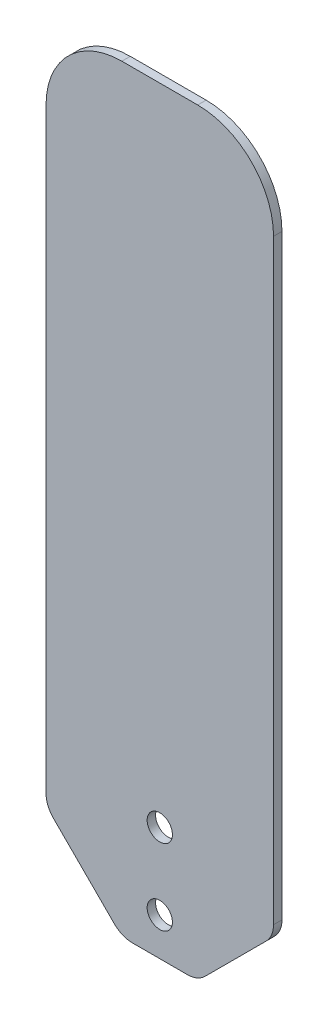
ISO-10303-21;
HEADER;
FILE_DESCRIPTION(('STEP AP214'),'2;1');
FILE_NAME('part.step','',(''),(''),'','','');
FILE_SCHEMA(('AUTOMOTIVE_DESIGN { 1 0 10303 214 1 1 1 1 }'));
ENDSEC;
DATA;
#1=APPLICATION_CONTEXT('core data for automotive mechanical design processes');
#2=APPLICATION_PROTOCOL_DEFINITION('international standard','automotive_design',2000,#1);
#3=PRODUCT_CONTEXT('',#1,'mechanical');
#4=PRODUCT('Part','Part','',(#3));
#5=PRODUCT_RELATED_PRODUCT_CATEGORY('part','',(#4));
#6=PRODUCT_DEFINITION_FORMATION('','',#4);
#7=PRODUCT_DEFINITION_CONTEXT('part definition',#1,'design');
#8=PRODUCT_DEFINITION('design','',#6,#7);
#9=PRODUCT_DEFINITION_SHAPE('','',#8);
#10=(LENGTH_UNIT() NAMED_UNIT(*) SI_UNIT(.MILLI.,.METRE.));
#11=(NAMED_UNIT(*) PLANE_ANGLE_UNIT() SI_UNIT($,.RADIAN.));
#12=(NAMED_UNIT(*) SI_UNIT($,.STERADIAN.) SOLID_ANGLE_UNIT());
#13=UNCERTAINTY_MEASURE_WITH_UNIT(LENGTH_MEASURE(1.E-05),#10,'distance_accuracy_value','');
#14=(GEOMETRIC_REPRESENTATION_CONTEXT(3) GLOBAL_UNCERTAINTY_ASSIGNED_CONTEXT((#13)) GLOBAL_UNIT_ASSIGNED_CONTEXT((#10,
#11,#12)) REPRESENTATION_CONTEXT('',''));
#15=CARTESIAN_POINT('',(0.,0.,0.));
#16=DIRECTION('',(0.,0.,1.));
#17=DIRECTION('',(1.,0.,0.));
#18=AXIS2_PLACEMENT_3D('',#15,#16,#17);
#19=CARTESIAN_POINT('',(103.6498900849,249.7618815997,1.));
#20=DIRECTION('',(0.,0.,1.));
#21=DIRECTION('',(1.,0.,0.));
#22=AXIS2_PLACEMENT_3D('',#19,#20,#21);
#23=PLANE('',#22);
#24=CARTESIAN_POINT('',(99.1498900849,173.2618815997,1.));
#25=DIRECTION('',(0.,0.,1.));
#26=DIRECTION('',(1.,0.,0.));
#27=AXIS2_PLACEMENT_3D('',#24,#25,#26);
#28=CIRCLE('',#27,1.5);
#29=CARTESIAN_POINT('',(100.6498900849,173.2618815997,1.));
#30=VERTEX_POINT('',#29);
#31=EDGE_CURVE('E158',#30,#30,#28,.T.);
#32=ORIENTED_EDGE('',*,*,#31,.F.);
#33=EDGE_LOOP('',(#32));
#34=FACE_BOUND('',#33,.T.);
#35=CARTESIAN_POINT('',(103.6498900849,249.7618815997,1.));
#36=DIRECTION('',(0.,0.,1.));
#37=DIRECTION('',(1.,0.,0.));
#38=AXIS2_PLACEMENT_3D('',#35,#36,#37);
#39=CIRCLE('',#38,9.00000000000001);
#40=CARTESIAN_POINT('',(112.6498900849,249.7618815997,1.));
#41=VERTEX_POINT('',#40);
#42=CARTESIAN_POINT('',(103.6498900849,258.7618815997,1.));
#43=VERTEX_POINT('',#42);
#44=EDGE_CURVE('E177',#41,#43,#39,.T.);
#45=ORIENTED_EDGE('',*,*,#44,.T.);
#46=DIRECTION('',(-1.,0.,0.));
#47=VECTOR('',#46,1.);
#48=CARTESIAN_POINT('',(103.6498900849,258.7618815997,1.));
#49=LINE('',#48,#47);
#50=CARTESIAN_POINT('',(94.6498900849,258.7618815997,1.));
#51=VERTEX_POINT('',#50);
#52=EDGE_CURVE('E105',#43,#51,#49,.T.);
#53=ORIENTED_EDGE('',*,*,#52,.T.);
#54=CARTESIAN_POINT('',(94.6498900849,249.7618815997,1.));
#55=DIRECTION('',(0.,0.,1.));
#56=DIRECTION('',(1.,0.,0.));
#57=AXIS2_PLACEMENT_3D('',#54,#55,#56);
#58=CIRCLE('',#57,9.00000000000001);
#59=CARTESIAN_POINT('',(85.6498900849,249.7618815997,1.));
#60=VERTEX_POINT('',#59);
#61=EDGE_CURVE('E204',#51,#60,#58,.T.);
#62=ORIENTED_EDGE('',*,*,#61,.T.);
#63=DIRECTION('',(0.,-1.,0.));
#64=VECTOR('',#63,1.);
#65=CARTESIAN_POINT('',(85.6498900849,249.7618815997,1.));
#66=LINE('',#65,#64);
#67=CARTESIAN_POINT('',(85.6498900849,179.0045222868,1.));
#68=VERTEX_POINT('',#67);
#69=EDGE_CURVE('E223',#60,#68,#66,.T.);
#70=ORIENTED_EDGE('',*,*,#69,.T.);
#71=CARTESIAN_POINT('',(88.6498900849,179.004522286819,1.));
#72=DIRECTION('',(0.,0.,1.));
#73=DIRECTION('',(1.,0.,0.));
#74=AXIS2_PLACEMENT_3D('',#71,#72,#73);
#75=CIRCLE('',#74,3.00000000000001);
#76=CARTESIAN_POINT('',(86.5285697414,176.8832019432,1.));
#77=VERTEX_POINT('',#76);
#78=EDGE_CURVE('E220',#68,#77,#75,.T.);
#79=ORIENTED_EDGE('',*,*,#78,.T.);
#80=DIRECTION('',(0.707106781186547,-0.707106781186548,0.));
#81=VECTOR('',#80,1.);
#82=CARTESIAN_POINT('',(93.7712104285,169.6405612561,1.));
#83=LINE('',#82,#81);
#84=CARTESIAN_POINT('',(93.7712104285,169.6405612561,1.));
#85=VERTEX_POINT('',#84);
#86=EDGE_CURVE('E222',#77,#85,#83,.T.);
#87=ORIENTED_EDGE('',*,*,#86,.T.);
#88=CARTESIAN_POINT('',(95.8925307720193,171.7618815997,1.));
#89=DIRECTION('',(0.,0.,1.));
#90=DIRECTION('',(1.,0.,0.));
#91=AXIS2_PLACEMENT_3D('',#88,#89,#90);
#92=CIRCLE('',#91,3.);
#93=CARTESIAN_POINT('',(95.8925307721,168.7618815997,1.));
#94=VERTEX_POINT('',#93);
#95=EDGE_CURVE('E225',#85,#94,#92,.T.);
#96=ORIENTED_EDGE('',*,*,#95,.T.);
#97=DIRECTION('',(1.,0.,0.));
#98=VECTOR('',#97,1.);
#99=CARTESIAN_POINT('',(95.8925307721,168.7618815997,1.));
#100=LINE('',#99,#98);
#101=CARTESIAN_POINT('',(102.4072493978,168.7618815997,1.));
#102=VERTEX_POINT('',#101);
#103=EDGE_CURVE('E231',#94,#102,#100,.T.);
#104=ORIENTED_EDGE('',*,*,#103,.T.);
#105=CARTESIAN_POINT('',(102.407249397881,171.7618815997,1.));
#106=DIRECTION('',(0.,0.,1.));
#107=DIRECTION('',(1.,0.,0.));
#108=AXIS2_PLACEMENT_3D('',#105,#106,#107);
#109=CIRCLE('',#108,3.00000000000001);
#110=CARTESIAN_POINT('',(104.5285697414,169.6405612561,1.));
#111=VERTEX_POINT('',#110);
#112=EDGE_CURVE('E136',#102,#111,#109,.T.);
#113=ORIENTED_EDGE('',*,*,#112,.T.);
#114=DIRECTION('',(0.707106781186546,0.707106781186549,0.));
#115=VECTOR('',#114,1.);
#116=CARTESIAN_POINT('',(104.5285697414,169.6405612561,1.));
#117=LINE('',#116,#115);
#118=CARTESIAN_POINT('',(111.7712104285,176.8832019432,1.));
#119=VERTEX_POINT('',#118);
#120=EDGE_CURVE('E130',#111,#119,#117,.T.);
#121=ORIENTED_EDGE('',*,*,#120,.T.);
#122=CARTESIAN_POINT('',(109.6498900849,179.004522286719,1.));
#123=DIRECTION('',(0.,0.,1.));
#124=DIRECTION('',(1.,0.,0.));
#125=AXIS2_PLACEMENT_3D('',#122,#123,#124);
#126=CIRCLE('',#125,3.);
#127=CARTESIAN_POINT('',(112.6498900849,179.0045222868,1.));
#128=VERTEX_POINT('',#127);
#129=EDGE_CURVE('E134',#119,#128,#126,.T.);
#130=ORIENTED_EDGE('',*,*,#129,.T.);
#131=DIRECTION('',(0.,1.,0.));
#132=VECTOR('',#131,1.);
#133=CARTESIAN_POINT('',(112.6498900849,179.0045222868,1.));
#134=LINE('',#133,#132);
#135=EDGE_CURVE('E50',#128,#41,#134,.T.);
#136=ORIENTED_EDGE('',*,*,#135,.T.);
#137=EDGE_LOOP('',(#45,#53,#62,#70,#79,#87,#96,#104,#113,#121,#130,#136));
#138=FACE_BOUND('',#137,.T.);
#139=CARTESIAN_POINT('',(99.1498900849,182.2618815997,1.));
#140=DIRECTION('',(0.,0.,1.));
#141=DIRECTION('',(1.,0.,0.));
#142=AXIS2_PLACEMENT_3D('',#139,#140,#141);
#143=CIRCLE('',#142,1.5);
#144=CARTESIAN_POINT('',(100.6498900849,182.2618815997,1.));
#145=VERTEX_POINT('',#144);
#146=EDGE_CURVE('E274',#145,#145,#143,.T.);
#147=ORIENTED_EDGE('',*,*,#146,.F.);
#148=EDGE_LOOP('',(#147));
#149=FACE_BOUND('',#148,.T.);
#150=ADVANCED_FACE('F33',(#34,#138,#149),#23,.T.);
#151=CARTESIAN_POINT('',(103.6498900849,249.7618815997,0.));
#152=DIRECTION('',(0.,0.,1.));
#153=DIRECTION('',(1.,0.,0.));
#154=AXIS2_PLACEMENT_3D('',#151,#152,#153);
#155=PLANE('',#154);
#156=CARTESIAN_POINT('',(99.1498900849,173.2618815997,0.));
#157=DIRECTION('',(0.,0.,1.));
#158=DIRECTION('',(1.,0.,0.));
#159=AXIS2_PLACEMENT_3D('',#156,#157,#158);
#160=CIRCLE('',#159,1.5);
#161=CARTESIAN_POINT('',(100.6498900849,173.2618815997,0.));
#162=VERTEX_POINT('',#161);
#163=EDGE_CURVE('E279',#162,#162,#160,.T.);
#164=ORIENTED_EDGE('',*,*,#163,.T.);
#165=EDGE_LOOP('',(#164));
#166=FACE_BOUND('',#165,.T.);
#167=CARTESIAN_POINT('',(103.6498900849,249.7618815997,0.));
#168=DIRECTION('',(0.,0.,1.));
#169=DIRECTION('',(1.,0.,0.));
#170=AXIS2_PLACEMENT_3D('',#167,#168,#169);
#171=CIRCLE('',#170,9.00000000000001);
#172=CARTESIAN_POINT('',(112.6498900849,249.7618815997,0.));
#173=VERTEX_POINT('',#172);
#174=CARTESIAN_POINT('',(103.6498900849,258.7618815997,0.));
#175=VERTEX_POINT('',#174);
#176=EDGE_CURVE('E154',#173,#175,#171,.T.);
#177=ORIENTED_EDGE('',*,*,#176,.F.);
#178=DIRECTION('',(0.,1.,0.));
#179=VECTOR('',#178,1.);
#180=CARTESIAN_POINT('',(112.6498900849,179.0045222868,0.));
#181=LINE('',#180,#179);
#182=CARTESIAN_POINT('',(112.6498900849,179.0045222868,0.));
#183=VERTEX_POINT('',#182);
#184=EDGE_CURVE('E97',#183,#173,#181,.T.);
#185=ORIENTED_EDGE('',*,*,#184,.F.);
#186=CARTESIAN_POINT('',(109.6498900849,179.004522286719,0.));
#187=DIRECTION('',(0.,0.,1.));
#188=DIRECTION('',(1.,0.,0.));
#189=AXIS2_PLACEMENT_3D('',#186,#187,#188);
#190=CIRCLE('',#189,3.);
#191=CARTESIAN_POINT('',(111.7712104285,176.8832019432,0.));
#192=VERTEX_POINT('',#191);
#193=EDGE_CURVE('E91',#192,#183,#190,.T.);
#194=ORIENTED_EDGE('',*,*,#193,.F.);
#195=DIRECTION('',(0.707106781186546,0.707106781186549,0.));
#196=VECTOR('',#195,1.);
#197=CARTESIAN_POINT('',(104.5285697414,169.6405612561,0.));
#198=LINE('',#197,#196);
#199=CARTESIAN_POINT('',(104.5285697414,169.6405612561,0.));
#200=VERTEX_POINT('',#199);
#201=EDGE_CURVE('E144',#200,#192,#198,.T.);
#202=ORIENTED_EDGE('',*,*,#201,.F.);
#203=CARTESIAN_POINT('',(102.407249397881,171.7618815997,0.));
#204=DIRECTION('',(0.,0.,1.));
#205=DIRECTION('',(1.,0.,0.));
#206=AXIS2_PLACEMENT_3D('',#203,#204,#205);
#207=CIRCLE('',#206,3.00000000000001);
#208=CARTESIAN_POINT('',(102.4072493978,168.7618815997,0.));
#209=VERTEX_POINT('',#208);
#210=EDGE_CURVE('E172',#209,#200,#207,.T.);
#211=ORIENTED_EDGE('',*,*,#210,.F.);
#212=DIRECTION('',(1.,0.,0.));
#213=VECTOR('',#212,1.);
#214=CARTESIAN_POINT('',(95.8925307721,168.7618815997,0.));
#215=LINE('',#214,#213);
#216=CARTESIAN_POINT('',(95.8925307721,168.7618815997,0.));
#217=VERTEX_POINT('',#216);
#218=EDGE_CURVE('E170',#217,#209,#215,.T.);
#219=ORIENTED_EDGE('',*,*,#218,.F.);
#220=CARTESIAN_POINT('',(95.8925307720193,171.7618815997,0.));
#221=DIRECTION('',(0.,0.,1.));
#222=DIRECTION('',(1.,0.,0.));
#223=AXIS2_PLACEMENT_3D('',#220,#221,#222);
#224=CIRCLE('',#223,3.);
#225=CARTESIAN_POINT('',(93.7712104285,169.6405612561,0.));
#226=VERTEX_POINT('',#225);
#227=EDGE_CURVE('E168',#226,#217,#224,.T.);
#228=ORIENTED_EDGE('',*,*,#227,.F.);
#229=DIRECTION('',(0.707106781186547,-0.707106781186548,0.));
#230=VECTOR('',#229,1.);
#231=CARTESIAN_POINT('',(93.7712104285,169.6405612561,0.));
#232=LINE('',#231,#230);
#233=CARTESIAN_POINT('',(86.5285697414,176.8832019432,0.));
#234=VERTEX_POINT('',#233);
#235=EDGE_CURVE('E166',#234,#226,#232,.T.);
#236=ORIENTED_EDGE('',*,*,#235,.F.);
#237=CARTESIAN_POINT('',(88.6498900849,179.004522286819,0.));
#238=DIRECTION('',(0.,0.,1.));
#239=DIRECTION('',(1.,0.,0.));
#240=AXIS2_PLACEMENT_3D('',#237,#238,#239);
#241=CIRCLE('',#240,3.00000000000001);
#242=CARTESIAN_POINT('',(85.6498900849,179.0045222868,0.));
#243=VERTEX_POINT('',#242);
#244=EDGE_CURVE('E164',#243,#234,#241,.T.);
#245=ORIENTED_EDGE('',*,*,#244,.F.);
#246=DIRECTION('',(0.,-1.,0.));
#247=VECTOR('',#246,1.);
#248=CARTESIAN_POINT('',(85.6498900849,249.7618815997,0.));
#249=LINE('',#248,#247);
#250=CARTESIAN_POINT('',(85.6498900849,249.7618815997,0.));
#251=VERTEX_POINT('',#250);
#252=EDGE_CURVE('E162',#251,#243,#249,.T.);
#253=ORIENTED_EDGE('',*,*,#252,.F.);
#254=CARTESIAN_POINT('',(94.6498900849,249.7618815997,0.));
#255=DIRECTION('',(0.,0.,1.));
#256=DIRECTION('',(1.,0.,0.));
#257=AXIS2_PLACEMENT_3D('',#254,#255,#256);
#258=CIRCLE('',#257,9.00000000000001);
#259=CARTESIAN_POINT('',(94.6498900849,258.7618815997,0.));
#260=VERTEX_POINT('',#259);
#261=EDGE_CURVE('E160',#260,#251,#258,.T.);
#262=ORIENTED_EDGE('',*,*,#261,.F.);
#263=DIRECTION('',(-1.,0.,0.));
#264=VECTOR('',#263,1.);
#265=CARTESIAN_POINT('',(103.6498900849,258.7618815997,0.));
#266=LINE('',#265,#264);
#267=EDGE_CURVE('E157',#175,#260,#266,.T.);
#268=ORIENTED_EDGE('',*,*,#267,.F.);
#269=EDGE_LOOP('',(#177,#185,#194,#202,#211,#219,#228,#236,#245,#253,#262,#268));
#270=FACE_BOUND('',#269,.T.);
#271=CARTESIAN_POINT('',(99.1498900849,182.2618815997,0.));
#272=DIRECTION('',(0.,0.,1.));
#273=DIRECTION('',(1.,0.,0.));
#274=AXIS2_PLACEMENT_3D('',#271,#272,#273);
#275=CIRCLE('',#274,1.5);
#276=CARTESIAN_POINT('',(100.6498900849,182.2618815997,0.));
#277=VERTEX_POINT('',#276);
#278=EDGE_CURVE('E277',#277,#277,#275,.T.);
#279=ORIENTED_EDGE('',*,*,#278,.T.);
#280=EDGE_LOOP('',(#279));
#281=FACE_BOUND('',#280,.T.);
#282=ADVANCED_FACE('F208',(#166,#270,#281),#155,.F.);
#283=CARTESIAN_POINT('',(103.6498900849,249.7618815997,1.));
#284=DIRECTION('',(0.,0.,-1.));
#285=DIRECTION('',(-1.,0.,0.));
#286=AXIS2_PLACEMENT_3D('',#283,#284,#285);
#287=CYLINDRICAL_SURFACE('',#286,9.00000000000001);
#288=ORIENTED_EDGE('',*,*,#176,.T.);
#289=DIRECTION('',(0.,0.,-1.));
#290=VECTOR('',#289,1.);
#291=CARTESIAN_POINT('',(103.6498900849,258.7618815997,1.));
#292=LINE('',#291,#290);
#293=EDGE_CURVE('E11',#43,#175,#292,.T.);
#294=ORIENTED_EDGE('',*,*,#293,.F.);
#295=ORIENTED_EDGE('',*,*,#44,.F.);
#296=DIRECTION('',(0.,0.,-1.));
#297=VECTOR('',#296,1.);
#298=CARTESIAN_POINT('',(112.6498900849,249.7618815997,1.));
#299=LINE('',#298,#297);
#300=EDGE_CURVE('E150',#41,#173,#299,.T.);
#301=ORIENTED_EDGE('',*,*,#300,.T.);
#302=EDGE_LOOP('',(#288,#294,#295,#301));
#303=FACE_BOUND('',#302,.T.);
#304=ADVANCED_FACE('F35',(#303),#287,.T.);
#305=CARTESIAN_POINT('',(103.6498900849,258.7618815997,1.));
#306=DIRECTION('',(0.,-1.,0.));
#307=DIRECTION('',(0.,0.,-1.));
#308=AXIS2_PLACEMENT_3D('',#305,#306,#307);
#309=PLANE('',#308);
#310=ORIENTED_EDGE('',*,*,#267,.T.);
#311=DIRECTION('',(0.,0.,-1.));
#312=VECTOR('',#311,1.);
#313=CARTESIAN_POINT('',(94.6498900849,258.7618815997,1.));
#314=LINE('',#313,#312);
#315=EDGE_CURVE('E42',#51,#260,#314,.T.);
#316=ORIENTED_EDGE('',*,*,#315,.F.);
#317=ORIENTED_EDGE('',*,*,#52,.F.);
#318=ORIENTED_EDGE('',*,*,#293,.T.);
#319=EDGE_LOOP('',(#310,#316,#317,#318));
#320=FACE_BOUND('',#319,.T.);
#321=ADVANCED_FACE('F372',(#320),#309,.F.);
#322=CARTESIAN_POINT('',(94.6498900849,249.7618815997,1.));
#323=DIRECTION('',(0.,0.,-1.));
#324=DIRECTION('',(-1.,0.,0.));
#325=AXIS2_PLACEMENT_3D('',#322,#323,#324);
#326=CYLINDRICAL_SURFACE('',#325,9.00000000000001);
#327=ORIENTED_EDGE('',*,*,#261,.T.);
#328=DIRECTION('',(0.,0.,-1.));
#329=VECTOR('',#328,1.);
#330=CARTESIAN_POINT('',(85.6498900849,249.7618815997,1.));
#331=LINE('',#330,#329);
#332=EDGE_CURVE('E196',#60,#251,#331,.T.);
#333=ORIENTED_EDGE('',*,*,#332,.F.);
#334=ORIENTED_EDGE('',*,*,#61,.F.);
#335=ORIENTED_EDGE('',*,*,#315,.T.);
#336=EDGE_LOOP('',(#327,#333,#334,#335));
#337=FACE_BOUND('',#336,.T.);
#338=ADVANCED_FACE('F202',(#337),#326,.T.);
#339=CARTESIAN_POINT('',(85.6498900849,249.7618815997,1.));
#340=DIRECTION('',(1.,0.,0.));
#341=DIRECTION('',(0.,0.,-1.));
#342=AXIS2_PLACEMENT_3D('',#339,#340,#341);
#343=PLANE('',#342);
#344=ORIENTED_EDGE('',*,*,#252,.T.);
#345=DIRECTION('',(0.,0.,-1.));
#346=VECTOR('',#345,1.);
#347=CARTESIAN_POINT('',(85.6498900849,179.0045222868,1.));
#348=LINE('',#347,#346);
#349=EDGE_CURVE('E193',#68,#243,#348,.T.);
#350=ORIENTED_EDGE('',*,*,#349,.F.);
#351=ORIENTED_EDGE('',*,*,#69,.F.);
#352=ORIENTED_EDGE('',*,*,#332,.T.);
#353=EDGE_LOOP('',(#344,#350,#351,#352));
#354=FACE_BOUND('',#353,.T.);
#355=ADVANCED_FACE('F214',(#354),#343,.F.);
#356=CARTESIAN_POINT('',(88.6498900849,179.004522286819,1.));
#357=DIRECTION('',(0.,0.,-1.));
#358=DIRECTION('',(-1.,0.,0.));
#359=AXIS2_PLACEMENT_3D('',#356,#357,#358);
#360=CYLINDRICAL_SURFACE('',#359,3.00000000000001);
#361=ORIENTED_EDGE('',*,*,#244,.T.);
#362=DIRECTION('',(0.,0.,-1.));
#363=VECTOR('',#362,1.);
#364=CARTESIAN_POINT('',(86.5285697414,176.8832019432,1.));
#365=LINE('',#364,#363);
#366=EDGE_CURVE('E190',#77,#234,#365,.T.);
#367=ORIENTED_EDGE('',*,*,#366,.F.);
#368=ORIENTED_EDGE('',*,*,#78,.F.);
#369=ORIENTED_EDGE('',*,*,#349,.T.);
#370=EDGE_LOOP('',(#361,#367,#368,#369));
#371=FACE_BOUND('',#370,.T.);
#372=ADVANCED_FACE('F218',(#371),#360,.T.);
#373=CARTESIAN_POINT('',(93.7712104285,169.6405612561,1.));
#374=DIRECTION('',(0.707106781186548,0.707106781186547,0.));
#375=DIRECTION('',(-0.707106781186547,0.707106781186548,0.));
#376=AXIS2_PLACEMENT_3D('',#373,#374,#375);
#377=PLANE('',#376);
#378=ORIENTED_EDGE('',*,*,#235,.T.);
#379=DIRECTION('',(0.,0.,-1.));
#380=VECTOR('',#379,1.);
#381=CARTESIAN_POINT('',(93.7712104285,169.6405612561,1.));
#382=LINE('',#381,#380);
#383=EDGE_CURVE('E187',#85,#226,#382,.T.);
#384=ORIENTED_EDGE('',*,*,#383,.F.);
#385=ORIENTED_EDGE('',*,*,#86,.F.);
#386=ORIENTED_EDGE('',*,*,#366,.T.);
#387=EDGE_LOOP('',(#378,#384,#385,#386));
#388=FACE_BOUND('',#387,.T.);
#389=ADVANCED_FACE('F337',(#388),#377,.F.);
#390=CARTESIAN_POINT('',(95.8925307720193,171.7618815997,1.));
#391=DIRECTION('',(0.,0.,-1.));
#392=DIRECTION('',(-1.,0.,0.));
#393=AXIS2_PLACEMENT_3D('',#390,#391,#392);
#394=CYLINDRICAL_SURFACE('',#393,3.);
#395=ORIENTED_EDGE('',*,*,#227,.T.);
#396=DIRECTION('',(0.,0.,-1.));
#397=VECTOR('',#396,1.);
#398=CARTESIAN_POINT('',(95.8925307721,168.7618815997,1.));
#399=LINE('',#398,#397);
#400=EDGE_CURVE('E184',#94,#217,#399,.T.);
#401=ORIENTED_EDGE('',*,*,#400,.F.);
#402=ORIENTED_EDGE('',*,*,#95,.F.);
#403=ORIENTED_EDGE('',*,*,#383,.T.);
#404=EDGE_LOOP('',(#395,#401,#402,#403));
#405=FACE_BOUND('',#404,.T.);
#406=ADVANCED_FACE('F328',(#405),#394,.T.);
#407=CARTESIAN_POINT('',(95.8925307721,168.7618815997,1.));
#408=DIRECTION('',(0.,1.,0.));
#409=DIRECTION('',(0.,0.,1.));
#410=AXIS2_PLACEMENT_3D('',#407,#408,#409);
#411=PLANE('',#410);
#412=ORIENTED_EDGE('',*,*,#218,.T.);
#413=DIRECTION('',(0.,0.,-1.));
#414=VECTOR('',#413,1.);
#415=CARTESIAN_POINT('',(102.4072493978,168.7618815997,1.));
#416=LINE('',#415,#414);
#417=EDGE_CURVE('E181',#102,#209,#416,.T.);
#418=ORIENTED_EDGE('',*,*,#417,.F.);
#419=ORIENTED_EDGE('',*,*,#103,.F.);
#420=ORIENTED_EDGE('',*,*,#400,.T.);
#421=EDGE_LOOP('',(#412,#418,#419,#420));
#422=FACE_BOUND('',#421,.T.);
#423=ADVANCED_FACE('F237',(#422),#411,.F.);
#424=CARTESIAN_POINT('',(102.407249397881,171.7618815997,1.));
#425=DIRECTION('',(0.,0.,-1.));
#426=DIRECTION('',(-1.,0.,0.));
#427=AXIS2_PLACEMENT_3D('',#424,#425,#426);
#428=CYLINDRICAL_SURFACE('',#427,3.00000000000001);
#429=ORIENTED_EDGE('',*,*,#210,.T.);
#430=DIRECTION('',(0.,0.,-1.));
#431=VECTOR('',#430,1.);
#432=CARTESIAN_POINT('',(104.5285697414,169.6405612561,1.));
#433=LINE('',#432,#431);
#434=EDGE_CURVE('E145',#111,#200,#433,.T.);
#435=ORIENTED_EDGE('',*,*,#434,.F.);
#436=ORIENTED_EDGE('',*,*,#112,.F.);
#437=ORIENTED_EDGE('',*,*,#417,.T.);
#438=EDGE_LOOP('',(#429,#435,#436,#437));
#439=FACE_BOUND('',#438,.T.);
#440=ADVANCED_FACE('F241',(#439),#428,.T.);
#441=CARTESIAN_POINT('',(104.5285697414,169.6405612561,1.));
#442=DIRECTION('',(-0.707106781186549,0.707106781186546,0.));
#443=DIRECTION('',(-0.707106781186546,-0.707106781186549,0.));
#444=AXIS2_PLACEMENT_3D('',#441,#442,#443);
#445=PLANE('',#444);
#446=ORIENTED_EDGE('',*,*,#201,.T.);
#447=DIRECTION('',(0.,0.,-1.));
#448=VECTOR('',#447,1.);
#449=CARTESIAN_POINT('',(111.7712104285,176.8832019432,1.));
#450=LINE('',#449,#448);
#451=EDGE_CURVE('E141',#119,#192,#450,.T.);
#452=ORIENTED_EDGE('',*,*,#451,.F.);
#453=ORIENTED_EDGE('',*,*,#120,.F.);
#454=ORIENTED_EDGE('',*,*,#434,.T.);
#455=EDGE_LOOP('',(#446,#452,#453,#454));
#456=FACE_BOUND('',#455,.T.);
#457=ADVANCED_FACE('F142',(#456),#445,.F.);
#458=CARTESIAN_POINT('',(109.6498900849,179.004522286719,1.));
#459=DIRECTION('',(0.,0.,-1.));
#460=DIRECTION('',(-1.,0.,0.));
#461=AXIS2_PLACEMENT_3D('',#458,#459,#460);
#462=CYLINDRICAL_SURFACE('',#461,3.);
#463=ORIENTED_EDGE('',*,*,#193,.T.);
#464=DIRECTION('',(0.,0.,-1.));
#465=VECTOR('',#464,1.);
#466=CARTESIAN_POINT('',(112.6498900849,179.0045222868,1.));
#467=LINE('',#466,#465);
#468=EDGE_CURVE('E146',#128,#183,#467,.T.);
#469=ORIENTED_EDGE('',*,*,#468,.F.);
#470=ORIENTED_EDGE('',*,*,#129,.F.);
#471=ORIENTED_EDGE('',*,*,#451,.T.);
#472=EDGE_LOOP('',(#463,#469,#470,#471));
#473=FACE_BOUND('',#472,.T.);
#474=ADVANCED_FACE('F148',(#473),#462,.T.);
#475=CARTESIAN_POINT('',(112.6498900849,179.0045222868,1.));
#476=DIRECTION('',(-1.,0.,0.));
#477=DIRECTION('',(0.,0.,1.));
#478=AXIS2_PLACEMENT_3D('',#475,#476,#477);
#479=PLANE('',#478);
#480=ORIENTED_EDGE('',*,*,#184,.T.);
#481=ORIENTED_EDGE('',*,*,#300,.F.);
#482=ORIENTED_EDGE('',*,*,#135,.F.);
#483=ORIENTED_EDGE('',*,*,#468,.T.);
#484=EDGE_LOOP('',(#480,#481,#482,#483));
#485=FACE_BOUND('',#484,.T.);
#486=ADVANCED_FACE('F245',(#485),#479,.F.);
#487=CARTESIAN_POINT('',(99.1498900849,173.2618815997,1.));
#488=DIRECTION('',(0.,0.,-1.));
#489=DIRECTION('',(-1.,0.,0.));
#490=AXIS2_PLACEMENT_3D('',#487,#488,#489);
#491=CYLINDRICAL_SURFACE('',#490,1.5);
#492=ORIENTED_EDGE('',*,*,#31,.T.);
#493=EDGE_LOOP('',(#492));
#494=FACE_BOUND('',#493,.T.);
#495=ORIENTED_EDGE('',*,*,#163,.F.);
#496=EDGE_LOOP('',(#495));
#497=FACE_BOUND('',#496,.T.);
#498=ADVANCED_FACE('F247',(#494,#497),#491,.F.);
#499=CARTESIAN_POINT('',(99.1498900849,182.2618815997,1.));
#500=DIRECTION('',(0.,0.,-1.));
#501=DIRECTION('',(-1.,0.,0.));
#502=AXIS2_PLACEMENT_3D('',#499,#500,#501);
#503=CYLINDRICAL_SURFACE('',#502,1.5);
#504=ORIENTED_EDGE('',*,*,#146,.T.);
#505=EDGE_LOOP('',(#504));
#506=FACE_BOUND('',#505,.T.);
#507=ORIENTED_EDGE('',*,*,#278,.F.);
#508=EDGE_LOOP('',(#507));
#509=FACE_BOUND('',#508,.T.);
#510=ADVANCED_FACE('F253',(#506,#509),#503,.F.);
#511=CLOSED_SHELL('',(#150,#282,#304,#321,#338,#355,#372,#389,#406,#423,#440,#457,#474,#486,
#498,#510));
#512=MANIFOLD_SOLID_BREP('B2',#511);
#513=ADVANCED_BREP_SHAPE_REPRESENTATION('',(#18,#512),#14);
#514=SHAPE_DEFINITION_REPRESENTATION(#9,#513);
ENDSEC;
END-ISO-10303-21;
